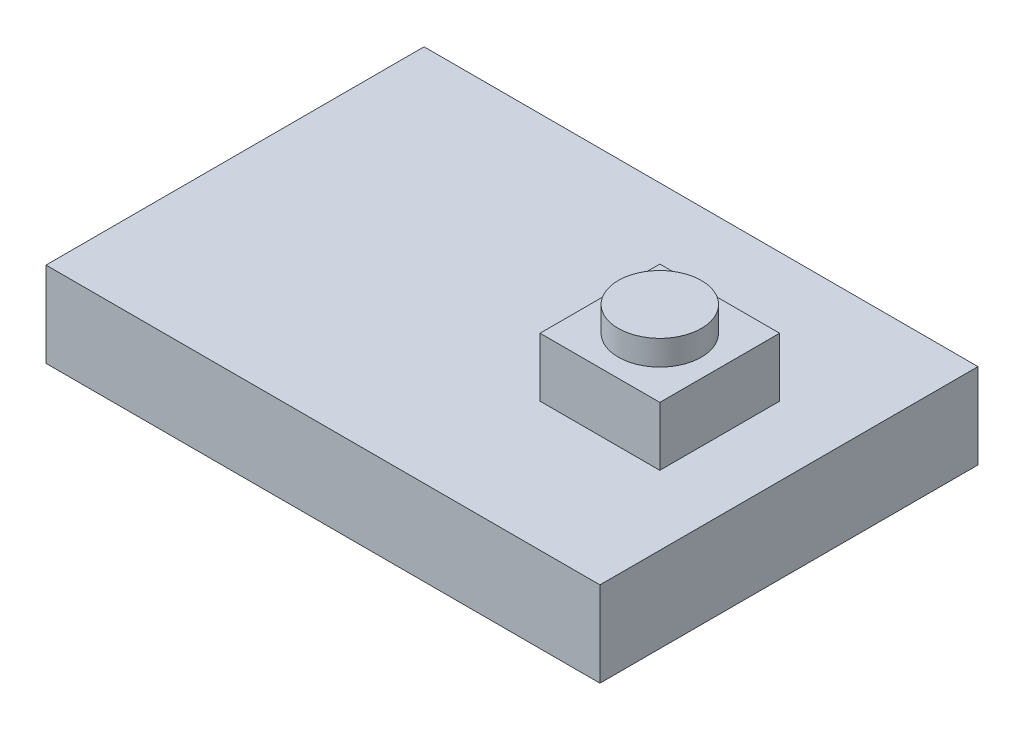
ISO-10303-21;
HEADER;
FILE_DESCRIPTION(('STEP AP214'),'2;1');
FILE_NAME('part.step','',(''),(''),'','','');
FILE_SCHEMA(('AUTOMOTIVE_DESIGN { 1 0 10303 214 1 1 1 1 }'));
ENDSEC;
DATA;
#1=APPLICATION_CONTEXT('core data for automotive mechanical design processes');
#2=APPLICATION_PROTOCOL_DEFINITION('international standard','automotive_design',2000,#1);
#3=PRODUCT_CONTEXT('',#1,'mechanical');
#4=PRODUCT('Part','Part','',(#3));
#5=PRODUCT_RELATED_PRODUCT_CATEGORY('part','',(#4));
#6=PRODUCT_DEFINITION_FORMATION('','',#4);
#7=PRODUCT_DEFINITION_CONTEXT('part definition',#1,'design');
#8=PRODUCT_DEFINITION('design','',#6,#7);
#9=PRODUCT_DEFINITION_SHAPE('','',#8);
#10=(LENGTH_UNIT() NAMED_UNIT(*) SI_UNIT(.MILLI.,.METRE.));
#11=(NAMED_UNIT(*) PLANE_ANGLE_UNIT() SI_UNIT($,.RADIAN.));
#12=(NAMED_UNIT(*) SI_UNIT($,.STERADIAN.) SOLID_ANGLE_UNIT());
#13=UNCERTAINTY_MEASURE_WITH_UNIT(LENGTH_MEASURE(1.E-05),#10,'distance_accuracy_value','');
#14=(GEOMETRIC_REPRESENTATION_CONTEXT(3) GLOBAL_UNCERTAINTY_ASSIGNED_CONTEXT((#13)) GLOBAL_UNIT_ASSIGNED_CONTEXT((#10,
#11,#12)) REPRESENTATION_CONTEXT('',''));
#15=CARTESIAN_POINT('',(0.,0.,0.));
#16=DIRECTION('',(0.,0.,1.));
#17=DIRECTION('',(1.,0.,0.));
#18=AXIS2_PLACEMENT_3D('',#15,#16,#17);
#19=CARTESIAN_POINT('',(0.,6.15,0.));
#20=DIRECTION('',(0.,1.,0.));
#21=DIRECTION('',(0.,0.,1.));
#22=AXIS2_PLACEMENT_3D('',#19,#20,#21);
#23=PLANE('',#22);
#24=DIRECTION('',(0.,0.,-1.));
#25=VECTOR('',#24,1.);
#26=CARTESIAN_POINT('',(20.,6.15,-13.65));
#27=LINE('',#26,#25);
#28=CARTESIAN_POINT('',(20.,6.15,13.65));
#29=VERTEX_POINT('',#28);
#30=CARTESIAN_POINT('',(20.,6.15,-13.65));
#31=VERTEX_POINT('',#30);
#32=EDGE_CURVE('E163',#29,#31,#27,.T.);
#33=ORIENTED_EDGE('',*,*,#32,.T.);
#34=DIRECTION('',(-1.,0.,0.));
#35=VECTOR('',#34,1.);
#36=CARTESIAN_POINT('',(-20.,6.15,-13.65));
#37=LINE('',#36,#35);
#38=CARTESIAN_POINT('',(-20.,6.15,-13.65));
#39=VERTEX_POINT('',#38);
#40=EDGE_CURVE('E94',#31,#39,#37,.T.);
#41=ORIENTED_EDGE('',*,*,#40,.T.);
#42=DIRECTION('',(0.,0.,1.));
#43=VECTOR('',#42,1.);
#44=CARTESIAN_POINT('',(-20.,6.15,-13.65));
#45=LINE('',#44,#43);
#46=CARTESIAN_POINT('',(-20.,6.15,13.65));
#47=VERTEX_POINT('',#46);
#48=EDGE_CURVE('E168',#39,#47,#45,.T.);
#49=ORIENTED_EDGE('',*,*,#48,.T.);
#50=DIRECTION('',(1.,0.,0.));
#51=VECTOR('',#50,1.);
#52=CARTESIAN_POINT('',(-20.,6.15,13.65));
#53=LINE('',#52,#51);
#54=EDGE_CURVE('E65',#47,#29,#53,.T.);
#55=ORIENTED_EDGE('',*,*,#54,.T.);
#56=EDGE_LOOP('',(#33,#41,#49,#55));
#57=FACE_BOUND('',#56,.T.);
#58=DIRECTION('',(1.,0.,0.));
#59=VECTOR('',#58,1.);
#60=CARTESIAN_POINT('',(0.,6.15,-4.325));
#61=LINE('',#60,#59);
#62=CARTESIAN_POINT('',(6.35,6.15,-4.325));
#63=VERTEX_POINT('',#62);
#64=CARTESIAN_POINT('',(15.,6.15,-4.325));
#65=VERTEX_POINT('',#64);
#66=EDGE_CURVE('E157',#63,#65,#61,.T.);
#67=ORIENTED_EDGE('',*,*,#66,.T.);
#68=DIRECTION('',(0.,0.,1.));
#69=VECTOR('',#68,1.);
#70=CARTESIAN_POINT('',(15.,6.15,0.));
#71=LINE('',#70,#69);
#72=CARTESIAN_POINT('',(15.,6.15,4.325));
#73=VERTEX_POINT('',#72);
#74=EDGE_CURVE('E142',#65,#73,#71,.T.);
#75=ORIENTED_EDGE('',*,*,#74,.T.);
#76=DIRECTION('',(-1.,0.,0.));
#77=VECTOR('',#76,1.);
#78=CARTESIAN_POINT('',(0.,6.15,4.325));
#79=LINE('',#78,#77);
#80=CARTESIAN_POINT('',(6.35,6.15,4.325));
#81=VERTEX_POINT('',#80);
#82=EDGE_CURVE('E144',#73,#81,#79,.T.);
#83=ORIENTED_EDGE('',*,*,#82,.T.);
#84=DIRECTION('',(0.,0.,-1.));
#85=VECTOR('',#84,1.);
#86=CARTESIAN_POINT('',(6.35,6.15,0.));
#87=LINE('',#86,#85);
#88=EDGE_CURVE('E149',#81,#63,#87,.T.);
#89=ORIENTED_EDGE('',*,*,#88,.T.);
#90=EDGE_LOOP('',(#67,#75,#83,#89));
#91=FACE_BOUND('',#90,.T.);
#92=ADVANCED_FACE('F39',(#57,#91),#23,.T.);
#93=CARTESIAN_POINT('',(20.,6.15,-13.65));
#94=DIRECTION('',(-1.,0.,0.));
#95=DIRECTION('',(0.,0.,1.));
#96=AXIS2_PLACEMENT_3D('',#93,#94,#95);
#97=PLANE('',#96);
#98=DIRECTION('',(0.,0.,-1.));
#99=VECTOR('',#98,1.);
#100=CARTESIAN_POINT('',(20.,0.,-13.65));
#101=LINE('',#100,#99);
#102=CARTESIAN_POINT('',(20.,0.,13.65));
#103=VERTEX_POINT('',#102);
#104=CARTESIAN_POINT('',(20.,0.,-13.65));
#105=VERTEX_POINT('',#104);
#106=EDGE_CURVE('E162',#103,#105,#101,.T.);
#107=ORIENTED_EDGE('',*,*,#106,.T.);
#108=DIRECTION('',(0.,-1.,0.));
#109=VECTOR('',#108,1.);
#110=CARTESIAN_POINT('',(20.,6.15,-13.65));
#111=LINE('',#110,#109);
#112=EDGE_CURVE('E43',#31,#105,#111,.T.);
#113=ORIENTED_EDGE('',*,*,#112,.F.);
#114=ORIENTED_EDGE('',*,*,#32,.F.);
#115=DIRECTION('',(0.,-1.,0.));
#116=VECTOR('',#115,1.);
#117=CARTESIAN_POINT('',(20.,6.15,13.65));
#118=LINE('',#117,#116);
#119=EDGE_CURVE('E173',#29,#103,#118,.T.);
#120=ORIENTED_EDGE('',*,*,#119,.T.);
#121=EDGE_LOOP('',(#107,#113,#114,#120));
#122=FACE_BOUND('',#121,.T.);
#123=ADVANCED_FACE('F41',(#122),#97,.F.);
#124=CARTESIAN_POINT('',(-20.,6.15,-13.65));
#125=DIRECTION('',(0.,0.,1.));
#126=DIRECTION('',(1.,0.,0.));
#127=AXIS2_PLACEMENT_3D('',#124,#125,#126);
#128=PLANE('',#127);
#129=DIRECTION('',(-1.,0.,0.));
#130=VECTOR('',#129,1.);
#131=CARTESIAN_POINT('',(-20.,0.,-13.65));
#132=LINE('',#131,#130);
#133=CARTESIAN_POINT('',(-20.,0.,-13.65));
#134=VERTEX_POINT('',#133);
#135=EDGE_CURVE('E177',#105,#134,#132,.T.);
#136=ORIENTED_EDGE('',*,*,#135,.T.);
#137=DIRECTION('',(0.,-1.,0.));
#138=VECTOR('',#137,1.);
#139=CARTESIAN_POINT('',(-20.,6.15,-13.65));
#140=LINE('',#139,#138);
#141=EDGE_CURVE('E189',#39,#134,#140,.T.);
#142=ORIENTED_EDGE('',*,*,#141,.F.);
#143=ORIENTED_EDGE('',*,*,#40,.F.);
#144=ORIENTED_EDGE('',*,*,#112,.T.);
#145=EDGE_LOOP('',(#136,#142,#143,#144));
#146=FACE_BOUND('',#145,.T.);
#147=ADVANCED_FACE('F197',(#146),#128,.F.);
#148=CARTESIAN_POINT('',(-20.,6.15,-13.65));
#149=DIRECTION('',(1.,0.,0.));
#150=DIRECTION('',(0.,0.,-1.));
#151=AXIS2_PLACEMENT_3D('',#148,#149,#150);
#152=PLANE('',#151);
#153=DIRECTION('',(0.,0.,1.));
#154=VECTOR('',#153,1.);
#155=CARTESIAN_POINT('',(-20.,0.,-13.65));
#156=LINE('',#155,#154);
#157=CARTESIAN_POINT('',(-20.,0.,13.65));
#158=VERTEX_POINT('',#157);
#159=EDGE_CURVE('E180',#134,#158,#156,.T.);
#160=ORIENTED_EDGE('',*,*,#159,.T.);
#161=DIRECTION('',(0.,-1.,0.));
#162=VECTOR('',#161,1.);
#163=CARTESIAN_POINT('',(-20.,6.15,13.65));
#164=LINE('',#163,#162);
#165=EDGE_CURVE('E187',#47,#158,#164,.T.);
#166=ORIENTED_EDGE('',*,*,#165,.F.);
#167=ORIENTED_EDGE('',*,*,#48,.F.);
#168=ORIENTED_EDGE('',*,*,#141,.T.);
#169=EDGE_LOOP('',(#160,#166,#167,#168));
#170=FACE_BOUND('',#169,.T.);
#171=ADVANCED_FACE('F204',(#170),#152,.F.);
#172=CARTESIAN_POINT('',(-20.,6.15,13.65));
#173=DIRECTION('',(0.,0.,-1.));
#174=DIRECTION('',(-1.,0.,0.));
#175=AXIS2_PLACEMENT_3D('',#172,#173,#174);
#176=PLANE('',#175);
#177=DIRECTION('',(1.,0.,0.));
#178=VECTOR('',#177,1.);
#179=CARTESIAN_POINT('',(-20.,0.,13.65));
#180=LINE('',#179,#178);
#181=EDGE_CURVE('E86',#158,#103,#180,.T.);
#182=ORIENTED_EDGE('',*,*,#181,.T.);
#183=ORIENTED_EDGE('',*,*,#119,.F.);
#184=ORIENTED_EDGE('',*,*,#54,.F.);
#185=ORIENTED_EDGE('',*,*,#165,.T.);
#186=EDGE_LOOP('',(#182,#183,#184,#185));
#187=FACE_BOUND('',#186,.T.);
#188=ADVANCED_FACE('F205',(#187),#176,.F.);
#189=CARTESIAN_POINT('',(0.,0.,0.));
#190=DIRECTION('',(0.,1.,0.));
#191=DIRECTION('',(0.,0.,1.));
#192=AXIS2_PLACEMENT_3D('',#189,#190,#191);
#193=PLANE('',#192);
#194=ORIENTED_EDGE('',*,*,#106,.F.);
#195=ORIENTED_EDGE('',*,*,#181,.F.);
#196=ORIENTED_EDGE('',*,*,#159,.F.);
#197=ORIENTED_EDGE('',*,*,#135,.F.);
#198=EDGE_LOOP('',(#194,#195,#196,#197));
#199=FACE_BOUND('',#198,.T.);
#200=ADVANCED_FACE('F202',(#199),#193,.F.);
#201=CARTESIAN_POINT('',(15.,10.4,0.));
#202=DIRECTION('',(-1.,0.,0.));
#203=DIRECTION('',(0.,0.,1.));
#204=AXIS2_PLACEMENT_3D('',#201,#202,#203);
#205=PLANE('',#204);
#206=ORIENTED_EDGE('',*,*,#74,.F.);
#207=DIRECTION('',(0.,-1.,0.));
#208=VECTOR('',#207,1.);
#209=CARTESIAN_POINT('',(15.,10.4,-4.325));
#210=LINE('',#209,#208);
#211=CARTESIAN_POINT('',(15.,10.4,-4.325));
#212=VERTEX_POINT('',#211);
#213=EDGE_CURVE('E121',#212,#65,#210,.T.);
#214=ORIENTED_EDGE('',*,*,#213,.F.);
#215=DIRECTION('',(0.,0.,-1.));
#216=VECTOR('',#215,1.);
#217=CARTESIAN_POINT('',(15.,10.4,0.));
#218=LINE('',#217,#216);
#219=CARTESIAN_POINT('',(15.,10.4,4.325));
#220=VERTEX_POINT('',#219);
#221=EDGE_CURVE('E129',#220,#212,#218,.T.);
#222=ORIENTED_EDGE('',*,*,#221,.F.);
#223=DIRECTION('',(0.,-1.,0.));
#224=VECTOR('',#223,1.);
#225=CARTESIAN_POINT('',(15.,10.4,4.325));
#226=LINE('',#225,#224);
#227=EDGE_CURVE('E214',#220,#73,#226,.T.);
#228=ORIENTED_EDGE('',*,*,#227,.T.);
#229=EDGE_LOOP('',(#206,#214,#222,#228));
#230=FACE_BOUND('',#229,.T.);
#231=ADVANCED_FACE('F140',(#230),#205,.F.);
#232=CARTESIAN_POINT('',(0.,10.4,-4.325));
#233=DIRECTION('',(0.,0.,1.));
#234=DIRECTION('',(1.,0.,0.));
#235=AXIS2_PLACEMENT_3D('',#232,#233,#234);
#236=PLANE('',#235);
#237=ORIENTED_EDGE('',*,*,#66,.F.);
#238=DIRECTION('',(0.,-1.,0.));
#239=VECTOR('',#238,1.);
#240=CARTESIAN_POINT('',(6.35,10.4,-4.325));
#241=LINE('',#240,#239);
#242=CARTESIAN_POINT('',(6.35,10.4,-4.325));
#243=VERTEX_POINT('',#242);
#244=EDGE_CURVE('E124',#243,#63,#241,.T.);
#245=ORIENTED_EDGE('',*,*,#244,.F.);
#246=DIRECTION('',(-1.,0.,0.));
#247=VECTOR('',#246,1.);
#248=CARTESIAN_POINT('',(0.,10.4,-4.325));
#249=LINE('',#248,#247);
#250=EDGE_CURVE('E117',#212,#243,#249,.T.);
#251=ORIENTED_EDGE('',*,*,#250,.F.);
#252=ORIENTED_EDGE('',*,*,#213,.T.);
#253=EDGE_LOOP('',(#237,#245,#251,#252));
#254=FACE_BOUND('',#253,.T.);
#255=ADVANCED_FACE('F119',(#254),#236,.F.);
#256=CARTESIAN_POINT('',(6.35,10.4,0.));
#257=DIRECTION('',(1.,0.,0.));
#258=DIRECTION('',(0.,0.,-1.));
#259=AXIS2_PLACEMENT_3D('',#256,#257,#258);
#260=PLANE('',#259);
#261=ORIENTED_EDGE('',*,*,#88,.F.);
#262=DIRECTION('',(0.,-1.,0.));
#263=VECTOR('',#262,1.);
#264=CARTESIAN_POINT('',(6.35,10.4,4.325));
#265=LINE('',#264,#263);
#266=CARTESIAN_POINT('',(6.35,10.4,4.325));
#267=VERTEX_POINT('',#266);
#268=EDGE_CURVE('E56',#267,#81,#265,.T.);
#269=ORIENTED_EDGE('',*,*,#268,.F.);
#270=DIRECTION('',(0.,0.,1.));
#271=VECTOR('',#270,1.);
#272=CARTESIAN_POINT('',(6.35,10.4,0.));
#273=LINE('',#272,#271);
#274=EDGE_CURVE('E128',#243,#267,#273,.T.);
#275=ORIENTED_EDGE('',*,*,#274,.F.);
#276=ORIENTED_EDGE('',*,*,#244,.T.);
#277=EDGE_LOOP('',(#261,#269,#275,#276));
#278=FACE_BOUND('',#277,.T.);
#279=ADVANCED_FACE('F210',(#278),#260,.F.);
#280=CARTESIAN_POINT('',(0.,10.4,4.325));
#281=DIRECTION('',(0.,0.,-1.));
#282=DIRECTION('',(-1.,0.,0.));
#283=AXIS2_PLACEMENT_3D('',#280,#281,#282);
#284=PLANE('',#283);
#285=ORIENTED_EDGE('',*,*,#82,.F.);
#286=ORIENTED_EDGE('',*,*,#227,.F.);
#287=DIRECTION('',(1.,0.,0.));
#288=VECTOR('',#287,1.);
#289=CARTESIAN_POINT('',(0.,10.4,4.325));
#290=LINE('',#289,#288);
#291=EDGE_CURVE('E133',#267,#220,#290,.T.);
#292=ORIENTED_EDGE('',*,*,#291,.F.);
#293=ORIENTED_EDGE('',*,*,#268,.T.);
#294=EDGE_LOOP('',(#285,#286,#292,#293));
#295=FACE_BOUND('',#294,.T.);
#296=ADVANCED_FACE('F219',(#295),#284,.F.);
#297=CARTESIAN_POINT('',(0.,10.4,0.));
#298=DIRECTION('',(0.,1.,0.));
#299=DIRECTION('',(0.,0.,1.));
#300=AXIS2_PLACEMENT_3D('',#297,#298,#299);
#301=PLANE('',#300);
#302=CARTESIAN_POINT('',(10.675,10.4,0.));
#303=DIRECTION('',(0.,1.,0.));
#304=DIRECTION('',(0.,0.,1.));
#305=AXIS2_PLACEMENT_3D('',#302,#303,#304);
#306=CIRCLE('',#305,3.);
#307=CARTESIAN_POINT('',(10.675,10.4,3.));
#308=VERTEX_POINT('',#307);
#309=EDGE_CURVE('E11',#308,#308,#306,.T.);
#310=ORIENTED_EDGE('',*,*,#309,.F.);
#311=EDGE_LOOP('',(#310));
#312=FACE_BOUND('',#311,.T.);
#313=ORIENTED_EDGE('',*,*,#221,.T.);
#314=ORIENTED_EDGE('',*,*,#250,.T.);
#315=ORIENTED_EDGE('',*,*,#274,.T.);
#316=ORIENTED_EDGE('',*,*,#291,.T.);
#317=EDGE_LOOP('',(#313,#314,#315,#316));
#318=FACE_BOUND('',#317,.T.);
#319=ADVANCED_FACE('F132',(#312,#318),#301,.T.);
#320=CARTESIAN_POINT('',(10.675,12.2,0.));
#321=DIRECTION('',(0.,-1.,0.));
#322=DIRECTION('',(0.,0.,-1.));
#323=AXIS2_PLACEMENT_3D('',#320,#321,#322);
#324=CYLINDRICAL_SURFACE('',#323,3.);
#325=CARTESIAN_POINT('',(10.675,12.2,0.));
#326=DIRECTION('',(0.,1.,0.));
#327=DIRECTION('',(0.,0.,1.));
#328=AXIS2_PLACEMENT_3D('',#325,#326,#327);
#329=CIRCLE('',#328,3.);
#330=CARTESIAN_POINT('',(10.675,12.2,3.));
#331=VERTEX_POINT('',#330);
#332=EDGE_CURVE('E138',#331,#331,#329,.T.);
#333=ORIENTED_EDGE('',*,*,#332,.F.);
#334=EDGE_LOOP('',(#333));
#335=FACE_BOUND('',#334,.T.);
#336=ORIENTED_EDGE('',*,*,#309,.T.);
#337=EDGE_LOOP('',(#336));
#338=FACE_BOUND('',#337,.T.);
#339=ADVANCED_FACE('F226',(#335,#338),#324,.T.);
#340=CARTESIAN_POINT('',(10.675,12.2,0.));
#341=DIRECTION('',(0.,1.,0.));
#342=DIRECTION('',(0.,0.,1.));
#343=AXIS2_PLACEMENT_3D('',#340,#341,#342);
#344=PLANE('',#343);
#345=ORIENTED_EDGE('',*,*,#332,.T.);
#346=EDGE_LOOP('',(#345));
#347=FACE_BOUND('',#346,.T.);
#348=ADVANCED_FACE('F298',(#347),#344,.T.);
#349=CLOSED_SHELL('',(#92,#123,#147,#171,#188,#200,#231,#255,#279,#296,#319,#339,#348));
#350=MANIFOLD_SOLID_BREP('B2',#349);
#351=ADVANCED_BREP_SHAPE_REPRESENTATION('',(#18,#350),#14);
#352=SHAPE_DEFINITION_REPRESENTATION(#9,#351);
ENDSEC;
END-ISO-10303-21;
